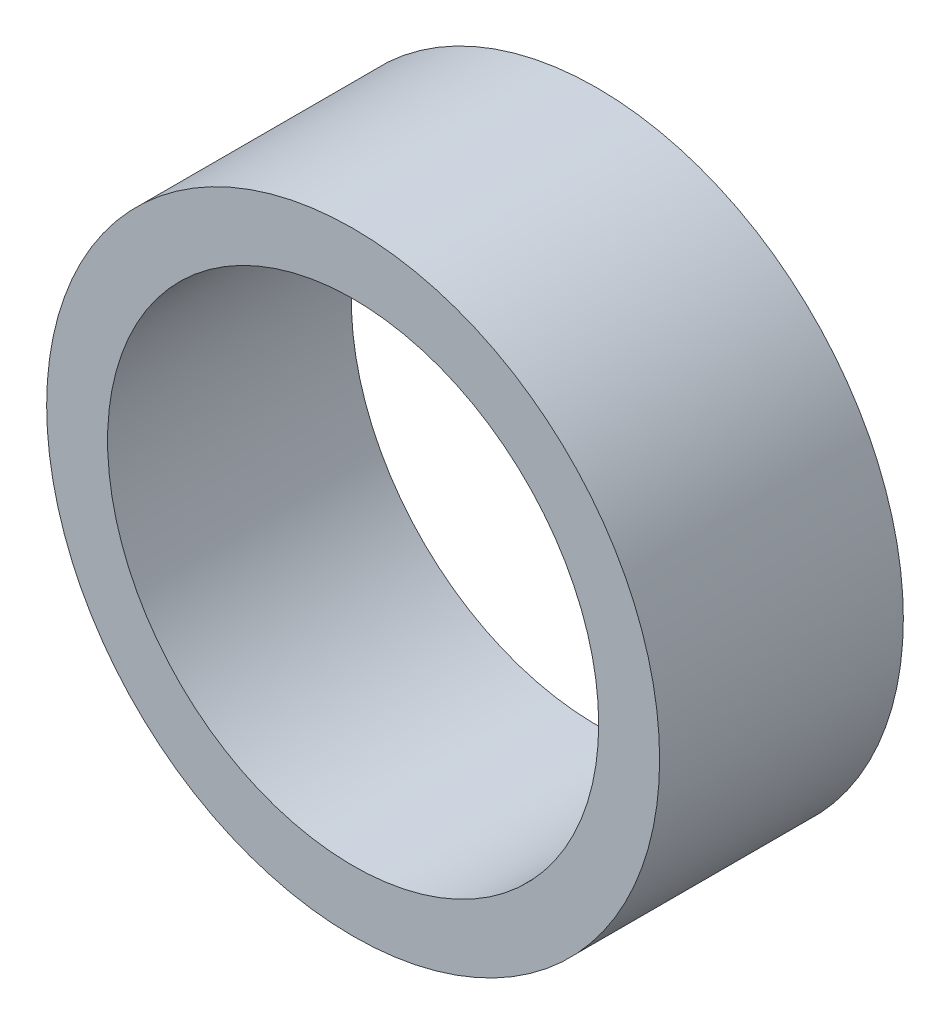
ISO-10303-21;
HEADER;
FILE_DESCRIPTION(('STEP AP214'),'2;1');
FILE_NAME('part.step','',(''),(''),'','','');
FILE_SCHEMA(('AUTOMOTIVE_DESIGN { 1 0 10303 214 1 1 1 1 }'));
ENDSEC;
DATA;
#1=APPLICATION_CONTEXT('core data for automotive mechanical design processes');
#2=APPLICATION_PROTOCOL_DEFINITION('international standard','automotive_design',2000,#1);
#3=PRODUCT_CONTEXT('',#1,'mechanical');
#4=PRODUCT('Part','Part','',(#3));
#5=PRODUCT_RELATED_PRODUCT_CATEGORY('part','',(#4));
#6=PRODUCT_DEFINITION_FORMATION('','',#4);
#7=PRODUCT_DEFINITION_CONTEXT('part definition',#1,'design');
#8=PRODUCT_DEFINITION('design','',#6,#7);
#9=PRODUCT_DEFINITION_SHAPE('','',#8);
#10=(LENGTH_UNIT() NAMED_UNIT(*) SI_UNIT(.MILLI.,.METRE.));
#11=(NAMED_UNIT(*) PLANE_ANGLE_UNIT() SI_UNIT($,.RADIAN.));
#12=(NAMED_UNIT(*) SI_UNIT($,.STERADIAN.) SOLID_ANGLE_UNIT());
#13=UNCERTAINTY_MEASURE_WITH_UNIT(LENGTH_MEASURE(1.E-05),#10,'distance_accuracy_value','');
#14=(GEOMETRIC_REPRESENTATION_CONTEXT(3) GLOBAL_UNCERTAINTY_ASSIGNED_CONTEXT((#13)) GLOBAL_UNIT_ASSIGNED_CONTEXT((#10,
#11,#12)) REPRESENTATION_CONTEXT('',''));
#15=CARTESIAN_POINT('',(0.,0.,0.));
#16=DIRECTION('',(0.,0.,1.));
#17=DIRECTION('',(1.,0.,0.));
#18=AXIS2_PLACEMENT_3D('',#15,#16,#17);
#19=CARTESIAN_POINT('',(0.,0.,4.));
#20=DIRECTION('',(0.,0.,1.));
#21=DIRECTION('',(1.,0.,0.));
#22=AXIS2_PLACEMENT_3D('',#19,#20,#21);
#23=PLANE('',#22);
#24=CARTESIAN_POINT('',(0.,0.,4.));
#25=DIRECTION('',(0.,0.,1.));
#26=DIRECTION('',(1.,0.,0.));
#27=AXIS2_PLACEMENT_3D('',#24,#25,#26);
#28=CIRCLE('',#27,5.03);
#29=CARTESIAN_POINT('',(5.03,0.,4.));
#30=VERTEX_POINT('',#29);
#31=EDGE_CURVE('E11',#30,#30,#28,.T.);
#32=ORIENTED_EDGE('',*,*,#31,.T.);
#33=EDGE_LOOP('',(#32));
#34=FACE_BOUND('',#33,.T.);
#35=CARTESIAN_POINT('',(0.,0.,4.));
#36=DIRECTION('',(0.,0.,1.));
#37=DIRECTION('',(1.,0.,0.));
#38=AXIS2_PLACEMENT_3D('',#35,#36,#37);
#39=CIRCLE('',#38,4.03);
#40=CARTESIAN_POINT('',(4.03,0.,4.));
#41=VERTEX_POINT('',#40);
#42=EDGE_CURVE('E61',#41,#41,#39,.T.);
#43=ORIENTED_EDGE('',*,*,#42,.F.);
#44=EDGE_LOOP('',(#43));
#45=FACE_BOUND('',#44,.T.);
#46=ADVANCED_FACE('F51',(#34,#45),#23,.T.);
#47=CARTESIAN_POINT('',(0.,0.,0.));
#48=DIRECTION('',(0.,0.,1.));
#49=DIRECTION('',(1.,0.,0.));
#50=AXIS2_PLACEMENT_3D('',#47,#48,#49);
#51=PLANE('',#50);
#52=CARTESIAN_POINT('',(0.,0.,0.));
#53=DIRECTION('',(0.,0.,1.));
#54=DIRECTION('',(1.,0.,0.));
#55=AXIS2_PLACEMENT_3D('',#52,#53,#54);
#56=CIRCLE('',#55,5.03);
#57=CARTESIAN_POINT('',(5.03,0.,0.));
#58=VERTEX_POINT('',#57);
#59=EDGE_CURVE('E54',#58,#58,#56,.T.);
#60=ORIENTED_EDGE('',*,*,#59,.F.);
#61=EDGE_LOOP('',(#60));
#62=FACE_BOUND('',#61,.T.);
#63=CARTESIAN_POINT('',(0.,0.,0.));
#64=DIRECTION('',(0.,0.,1.));
#65=DIRECTION('',(1.,0.,0.));
#66=AXIS2_PLACEMENT_3D('',#63,#64,#65);
#67=CIRCLE('',#66,4.03);
#68=CARTESIAN_POINT('',(4.03,0.,0.));
#69=VERTEX_POINT('',#68);
#70=EDGE_CURVE('E67',#69,#69,#67,.T.);
#71=ORIENTED_EDGE('',*,*,#70,.T.);
#72=EDGE_LOOP('',(#71));
#73=FACE_BOUND('',#72,.T.);
#74=ADVANCED_FACE('F79',(#62,#73),#51,.F.);
#75=CARTESIAN_POINT('',(0.,0.,4.));
#76=DIRECTION('',(0.,0.,-1.));
#77=DIRECTION('',(-1.,0.,0.));
#78=AXIS2_PLACEMENT_3D('',#75,#76,#77);
#79=CYLINDRICAL_SURFACE('',#78,5.03);
#80=ORIENTED_EDGE('',*,*,#31,.F.);
#81=EDGE_LOOP('',(#80));
#82=FACE_BOUND('',#81,.T.);
#83=ORIENTED_EDGE('',*,*,#59,.T.);
#84=EDGE_LOOP('',(#83));
#85=FACE_BOUND('',#84,.T.);
#86=ADVANCED_FACE('F52',(#82,#85),#79,.T.);
#87=CARTESIAN_POINT('',(0.,0.,4.));
#88=DIRECTION('',(0.,0.,-1.));
#89=DIRECTION('',(-1.,0.,0.));
#90=AXIS2_PLACEMENT_3D('',#87,#88,#89);
#91=CYLINDRICAL_SURFACE('',#90,4.03);
#92=ORIENTED_EDGE('',*,*,#42,.T.);
#93=EDGE_LOOP('',(#92));
#94=FACE_BOUND('',#93,.T.);
#95=ORIENTED_EDGE('',*,*,#70,.F.);
#96=EDGE_LOOP('',(#95));
#97=FACE_BOUND('',#96,.T.);
#98=ADVANCED_FACE('F74',(#94,#97),#91,.F.);
#99=CLOSED_SHELL('',(#46,#74,#86,#98));
#100=MANIFOLD_SOLID_BREP('B2',#99);
#101=ADVANCED_BREP_SHAPE_REPRESENTATION('',(#18,#100),#14);
#102=SHAPE_DEFINITION_REPRESENTATION(#9,#101);
ENDSEC;
END-ISO-10303-21;
